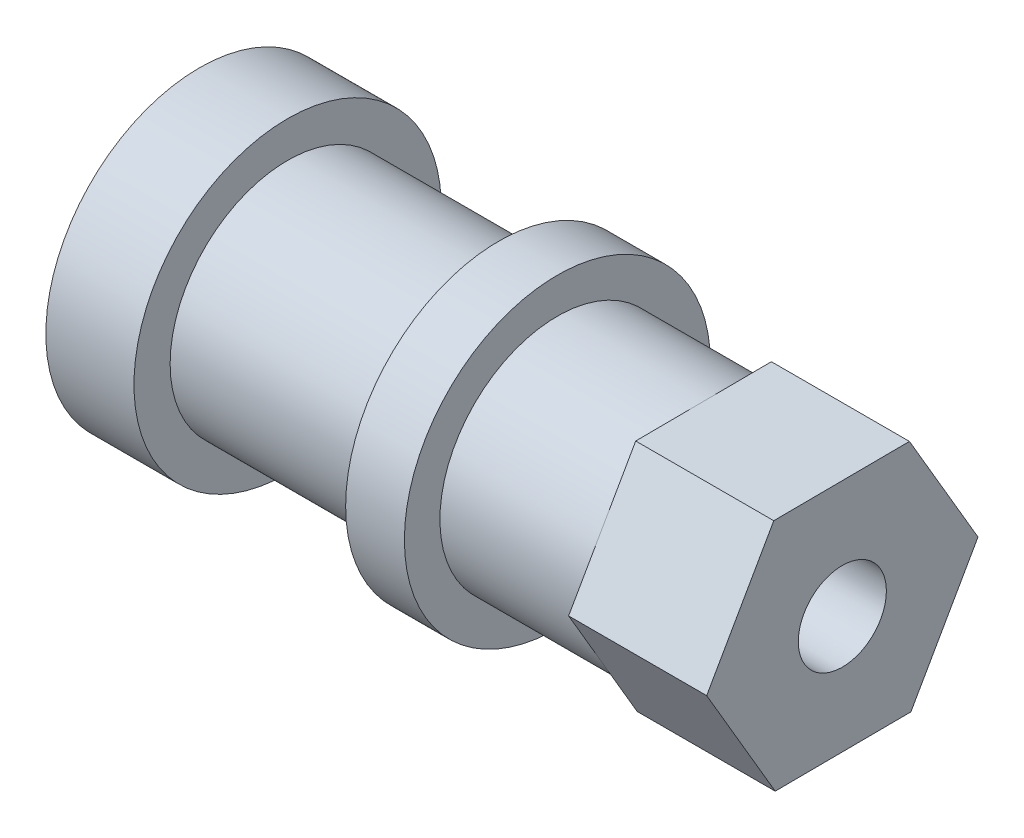
ISO-10303-21;
HEADER;
FILE_DESCRIPTION(('STEP AP214'),'2;1');
FILE_NAME('part.step','',(''),(''),'','','');
FILE_SCHEMA(('AUTOMOTIVE_DESIGN { 1 0 10303 214 1 1 1 1 }'));
ENDSEC;
DATA;
#1=APPLICATION_CONTEXT('core data for automotive mechanical design processes');
#2=APPLICATION_PROTOCOL_DEFINITION('international standard','automotive_design',2000,#1);
#3=PRODUCT_CONTEXT('',#1,'mechanical');
#4=PRODUCT('Part','Part','',(#3));
#5=PRODUCT_RELATED_PRODUCT_CATEGORY('part','',(#4));
#6=PRODUCT_DEFINITION_FORMATION('','',#4);
#7=PRODUCT_DEFINITION_CONTEXT('part definition',#1,'design');
#8=PRODUCT_DEFINITION('design','',#6,#7);
#9=PRODUCT_DEFINITION_SHAPE('','',#8);
#10=(LENGTH_UNIT() NAMED_UNIT(*) SI_UNIT(.MILLI.,.METRE.));
#11=(NAMED_UNIT(*) PLANE_ANGLE_UNIT() SI_UNIT($,.RADIAN.));
#12=(NAMED_UNIT(*) SI_UNIT($,.STERADIAN.) SOLID_ANGLE_UNIT());
#13=UNCERTAINTY_MEASURE_WITH_UNIT(LENGTH_MEASURE(1.E-05),#10,'distance_accuracy_value','');
#14=(GEOMETRIC_REPRESENTATION_CONTEXT(3) GLOBAL_UNCERTAINTY_ASSIGNED_CONTEXT((#13)) GLOBAL_UNIT_ASSIGNED_CONTEXT((#10,
#11,#12)) REPRESENTATION_CONTEXT('',''));
#15=CARTESIAN_POINT('',(0.,0.,0.));
#16=DIRECTION('',(0.,0.,1.));
#17=DIRECTION('',(1.,0.,0.));
#18=AXIS2_PLACEMENT_3D('',#15,#16,#17);
#19=CARTESIAN_POINT('',(-28.4987084989847,0.,0.));
#20=DIRECTION('',(1.,0.,0.));
#21=DIRECTION('',(0.,0.,-1.));
#22=AXIS2_PLACEMENT_3D('',#19,#20,#21);
#23=CYLINDRICAL_SURFACE('',#22,4.);
#24=CARTESIAN_POINT('',(0.,0.,0.));
#25=DIRECTION('',(-1.,0.,0.));
#26=DIRECTION('',(0.,0.,1.));
#27=AXIS2_PLACEMENT_3D('',#24,#25,#26);
#28=CIRCLE('',#27,4.);
#29=CARTESIAN_POINT('',(0.,1.97830942188002,3.47653445708521));
#30=VERTEX_POINT('',#29);
#31=CARTESIAN_POINT('',(0.,3.99992186790774,0.0250010126484));
#32=VERTEX_POINT('',#31);
#33=EDGE_CURVE('E214',#30,#32,#28,.T.);
#34=ORIENTED_EDGE('',*,*,#33,.T.);
#35=CARTESIAN_POINT('',(0.,2.02161244602772,-3.45153344443681));
#36=VERTEX_POINT('',#35);
#37=EDGE_CURVE('E219',#32,#36,#28,.T.);
#38=ORIENTED_EDGE('',*,*,#37,.T.);
#39=CARTESIAN_POINT('',(0.,-1.97830942188002,-3.47653445708521));
#40=VERTEX_POINT('',#39);
#41=EDGE_CURVE('E384',#36,#40,#28,.T.);
#42=ORIENTED_EDGE('',*,*,#41,.T.);
#43=CARTESIAN_POINT('',(0.,-3.99992186790774,-0.0250010126484015));
#44=VERTEX_POINT('',#43);
#45=EDGE_CURVE('E381',#40,#44,#28,.T.);
#46=ORIENTED_EDGE('',*,*,#45,.T.);
#47=CARTESIAN_POINT('',(0.,-2.02161244602772,3.45153344443681));
#48=VERTEX_POINT('',#47);
#49=EDGE_CURVE('E62',#44,#48,#28,.T.);
#50=ORIENTED_EDGE('',*,*,#49,.T.);
#51=EDGE_CURVE('E223',#48,#30,#28,.T.);
#52=ORIENTED_EDGE('',*,*,#51,.T.);
#53=EDGE_LOOP('',(#34,#38,#42,#46,#50,#52));
#54=FACE_BOUND('',#53,.T.);
#55=CARTESIAN_POINT('',(-4.99999999999995,0.,0.));
#56=DIRECTION('',(-1.,0.,0.));
#57=DIRECTION('',(0.,-1.,0.));
#58=AXIS2_PLACEMENT_3D('',#55,#56,#57);
#59=CIRCLE('',#58,4.);
#60=CARTESIAN_POINT('',(-4.99999999999995,-4.,0.));
#61=VERTEX_POINT('',#60);
#62=EDGE_CURVE('E11',#61,#61,#59,.T.);
#63=ORIENTED_EDGE('',*,*,#62,.F.);
#64=EDGE_LOOP('',(#63));
#65=FACE_BOUND('',#64,.T.);
#66=ADVANCED_FACE('F39',(#54,#65),#23,.T.);
#67=CARTESIAN_POINT('',(-28.4987084989847,0.,0.));
#68=DIRECTION('',(1.,0.,0.));
#69=DIRECTION('',(0.,0.,-1.));
#70=AXIS2_PLACEMENT_3D('',#67,#68,#69);
#71=CYLINDRICAL_SURFACE('',#70,1.5);
#72=CARTESIAN_POINT('',(-15.1849999999999,0.,0.));
#73=DIRECTION('',(-1.,0.,0.));
#74=DIRECTION('',(0.,0.,1.));
#75=AXIS2_PLACEMENT_3D('',#72,#73,#74);
#76=CIRCLE('',#75,1.5);
#77=CARTESIAN_POINT('',(-15.1849999999999,0.,-1.5));
#78=VERTEX_POINT('',#77);
#79=EDGE_CURVE('E199',#78,#78,#76,.T.);
#80=CARTESIAN_POINT('',(4.7,0.,0.));
#81=DIRECTION('',(1.,0.,0.));
#82=DIRECTION('',(0.,0.,-1.));
#83=AXIS2_PLACEMENT_3D('',#80,#81,#82);
#84=CIRCLE('',#83,1.5);
#85=CARTESIAN_POINT('',(4.69999999999999,0.,-1.5));
#86=VERTEX_POINT('',#85);
#87=EDGE_CURVE('E207',#86,#86,#84,.T.);
#88=CARTESIAN_POINT('',(-15.1849999999999,0.,-1.5));
#89=CARTESIAN_POINT('',(-14.9778645833332,0.,-1.5));
#90=CARTESIAN_POINT('',(-14.7707291666666,0.,-1.5));
#91=CARTESIAN_POINT('',(-14.3564583333332,0.,-1.5));
#92=CARTESIAN_POINT('',(-14.1493229166666,0.,-1.5));
#93=CARTESIAN_POINT('',(-13.7350520833332,0.,-1.5));
#94=CARTESIAN_POINT('',(-13.5279166666666,0.,-1.5));
#95=CARTESIAN_POINT('',(-13.1136458333332,0.,-1.5));
#96=CARTESIAN_POINT('',(-12.9065104166666,0.,-1.5));
#97=CARTESIAN_POINT('',(-12.4922395833332,0.,-1.5));
#98=CARTESIAN_POINT('',(-12.2851041666666,0.,-1.5));
#99=CARTESIAN_POINT('',(-11.8708333333333,0.,-1.5));
#100=CARTESIAN_POINT('',(-11.6636979166666,0.,-1.5));
#101=CARTESIAN_POINT('',(-11.2494270833333,0.,-1.5));
#102=CARTESIAN_POINT('',(-11.0422916666666,0.,-1.5));
#103=CARTESIAN_POINT('',(-10.6280208333333,0.,-1.5));
#104=CARTESIAN_POINT('',(-10.4208854166666,0.,-1.5));
#105=CARTESIAN_POINT('',(-10.0066145833333,0.,-1.5));
#106=CARTESIAN_POINT('',(-9.7994791666666,0.,-1.5));
#107=CARTESIAN_POINT('',(-9.38520833333327,0.,-1.5));
#108=CARTESIAN_POINT('',(-9.1780729166666,0.,-1.5));
#109=CARTESIAN_POINT('',(-8.76380208333327,0.,-1.5));
#110=CARTESIAN_POINT('',(-8.5566666666666,0.,-1.5));
#111=CARTESIAN_POINT('',(-8.14239583333327,0.,-1.5));
#112=CARTESIAN_POINT('',(-7.93526041666661,0.,-1.5));
#113=CARTESIAN_POINT('',(-7.52098958333327,0.,-1.5));
#114=CARTESIAN_POINT('',(-7.31385416666661,0.,-1.5));
#115=CARTESIAN_POINT('',(-6.89958333333328,0.,-1.5));
#116=CARTESIAN_POINT('',(-6.69244791666661,0.,-1.5));
#117=CARTESIAN_POINT('',(-6.27817708333328,0.,-1.5));
#118=CARTESIAN_POINT('',(-6.07104166666661,0.,-1.5));
#119=CARTESIAN_POINT('',(-5.65677083333328,0.,-1.5));
#120=CARTESIAN_POINT('',(-5.44963541666662,0.,-1.5));
#121=CARTESIAN_POINT('',(-5.03536458333329,0.,-1.5));
#122=CARTESIAN_POINT('',(-4.82822916666662,0.,-1.5));
#123=CARTESIAN_POINT('',(-4.41395833333329,0.,-1.5));
#124=CARTESIAN_POINT('',(-4.20682291666663,0.,-1.5));
#125=CARTESIAN_POINT('',(-3.79255208333329,0.,-1.5));
#126=CARTESIAN_POINT('',(-3.58541666666663,0.,-1.5));
#127=CARTESIAN_POINT('',(-3.1711458333333,0.,-1.5));
#128=CARTESIAN_POINT('',(-2.96401041666663,0.,-1.5));
#129=CARTESIAN_POINT('',(-2.5497395833333,0.,-1.5));
#130=CARTESIAN_POINT('',(-2.34260416666663,0.,-1.5));
#131=CARTESIAN_POINT('',(-1.9283333333333,0.,-1.5));
#132=CARTESIAN_POINT('',(-1.72119791666664,0.,-1.5));
#133=CARTESIAN_POINT('',(-1.30692708333331,0.,-1.5));
#134=CARTESIAN_POINT('',(-1.09979166666664,0.,-1.5));
#135=CARTESIAN_POINT('',(-0.685520833333309,0.,-1.5));
#136=CARTESIAN_POINT('',(-0.478385416666645,0.,-1.5));
#137=CARTESIAN_POINT('',(-0.0641145833333139,0.,-1.5));
#138=CARTESIAN_POINT('',(0.143020833333352,0.,-1.5));
#139=CARTESIAN_POINT('',(0.557291666666684,0.,-1.5));
#140=CARTESIAN_POINT('',(0.76442708333335,0.,-1.5));
#141=CARTESIAN_POINT('',(1.17869791666668,0.,-1.5));
#142=CARTESIAN_POINT('',(1.38583333333335,0.,-1.5));
#143=CARTESIAN_POINT('',(1.80010416666668,0.,-1.5));
#144=CARTESIAN_POINT('',(2.00723958333334,0.,-1.5));
#145=CARTESIAN_POINT('',(2.42151041666667,0.,-1.5));
#146=CARTESIAN_POINT('',(2.62864583333334,0.,-1.5));
#147=CARTESIAN_POINT('',(3.04291666666666,0.,-1.5));
#148=CARTESIAN_POINT('',(3.25005208333333,0.,-1.5));
#149=CARTESIAN_POINT('',(3.66432291666666,0.,-1.5));
#150=CARTESIAN_POINT('',(3.87145833333333,0.,-1.5));
#151=CARTESIAN_POINT('',(4.28572916666666,0.,-1.5));
#152=CARTESIAN_POINT('',(4.49286458333333,0.,-1.5));
#153=CARTESIAN_POINT('',(4.69999999999999,0.,-1.5));
#154=B_SPLINE_CURVE_WITH_KNOTS('',3,(#88,#89,#90,#91,#92,#93,#94,#95,#96,#97,#98,#99,#100,#101,
#102,#103,#104,#105,#106,#107,#108,#109,#110,#111,#112,#113,#114,#115,#116,#117,#118,#119,#120,
#121,#122,#123,#124,#125,#126,#127,#128,#129,#130,#131,#132,#133,#134,#135,#136,#137,#138,#139,
#140,#141,#142,#143,#144,#145,#146,#147,#148,#149,#150,#151,#152,#153),.UNSPECIFIED.,.F.,.F.,(4,
2,2,2,2,2,2,2,2,2,2,2,2,2,2,2,2,2,2,2,2,2,2,2,2,2,2,2,2,2,2,2,4),(0.,0.621406249999996,
1.24281249999999,1.86421874999999,2.48562499999999,3.10703124999998,3.72843749999998,
4.34984374999998,4.97124999999997,5.59265624999997,6.21406249999997,6.83546874999996,
7.45687499999996,8.07828124999996,8.69968749999995,9.32109374999995,9.94249999999995,
10.5639062499999,11.1853124999999,11.8067187499999,12.4281249999999,13.0495312499999,
13.6709374999999,14.2923437499999,14.9137499999999,15.5351562499999,16.1565624999999,
16.7779687499999,17.3993749999999,18.0207812499999,18.6421874999999,19.2635937499999,
19.8849999999999),.UNSPECIFIED.);
#155=EDGE_CURVE('BSEAM305',#78,#86,#154,.T.);
#156=ORIENTED_EDGE('',*,*,#79,.T.);
#157=ORIENTED_EDGE('',*,*,#87,.T.);
#158=ORIENTED_EDGE('',*,*,#155,.T.);
#159=ORIENTED_EDGE('',*,*,#155,.F.);
#160=EDGE_LOOP('',(#156,#158,#157,#159));
#161=FACE_BOUND('',#160,.T.);
#162=ADVANCED_FACE('F305',(#161),#71,.F.);
#163=CARTESIAN_POINT('',(-6.99999999999996,0.,0.));
#164=DIRECTION('',(-1.,0.,0.));
#165=DIRECTION('',(0.,-1.,0.));
#166=AXIS2_PLACEMENT_3D('',#163,#164,#165);
#167=CIRCLE('',#166,4.);
#168=CARTESIAN_POINT('',(-6.99999999999996,0.,-4.));
#169=VERTEX_POINT('',#168);
#170=EDGE_CURVE('E187',#169,#169,#167,.T.);
#171=CARTESIAN_POINT('',(-14.1849999999999,0.,0.));
#172=DIRECTION('',(-1.,0.,0.));
#173=DIRECTION('',(0.,-1.,0.));
#174=AXIS2_PLACEMENT_3D('',#171,#172,#173);
#175=CIRCLE('',#174,4.);
#176=CARTESIAN_POINT('',(-14.1849999999999,0.,-4.));
#177=VERTEX_POINT('',#176);
#178=EDGE_CURVE('E47',#177,#177,#175,.T.);
#179=CARTESIAN_POINT('',(-6.99999999999996,0.,-4.));
#180=CARTESIAN_POINT('',(-7.07484374999996,0.,-4.));
#181=CARTESIAN_POINT('',(-7.14968749999996,0.,-4.));
#182=CARTESIAN_POINT('',(-7.29937499999996,0.,-4.));
#183=CARTESIAN_POINT('',(-7.37421874999996,0.,-4.));
#184=CARTESIAN_POINT('',(-7.52390624999995,0.,-4.));
#185=CARTESIAN_POINT('',(-7.59874999999995,0.,-4.));
#186=CARTESIAN_POINT('',(-7.74843749999995,0.,-4.));
#187=CARTESIAN_POINT('',(-7.82328124999995,0.,-4.));
#188=CARTESIAN_POINT('',(-7.97296874999995,0.,-4.));
#189=CARTESIAN_POINT('',(-8.04781249999995,0.,-4.));
#190=CARTESIAN_POINT('',(-8.19749999999995,0.,-4.));
#191=CARTESIAN_POINT('',(-8.27234374999995,0.,-4.));
#192=CARTESIAN_POINT('',(-8.42203124999995,0.,-4.));
#193=CARTESIAN_POINT('',(-8.49687499999995,0.,-4.));
#194=CARTESIAN_POINT('',(-8.64656249999995,0.,-4.));
#195=CARTESIAN_POINT('',(-8.72140624999994,0.,-4.));
#196=CARTESIAN_POINT('',(-8.87109374999994,0.,-4.));
#197=CARTESIAN_POINT('',(-8.94593749999994,0.,-4.));
#198=CARTESIAN_POINT('',(-9.09562499999994,0.,-4.));
#199=CARTESIAN_POINT('',(-9.17046874999994,0.,-4.));
#200=CARTESIAN_POINT('',(-9.32015624999994,0.,-4.));
#201=CARTESIAN_POINT('',(-9.39499999999994,0.,-4.));
#202=CARTESIAN_POINT('',(-9.54468749999994,0.,-4.));
#203=CARTESIAN_POINT('',(-9.61953124999994,0.,-4.));
#204=CARTESIAN_POINT('',(-9.76921874999993,0.,-4.));
#205=CARTESIAN_POINT('',(-9.84406249999994,0.,-4.));
#206=CARTESIAN_POINT('',(-9.99374999999993,0.,-4.));
#207=CARTESIAN_POINT('',(-10.0685937499999,0.,-4.));
#208=CARTESIAN_POINT('',(-10.2182812499999,0.,-4.));
#209=CARTESIAN_POINT('',(-10.2931249999999,0.,-4.));
#210=CARTESIAN_POINT('',(-10.4428124999999,0.,-4.));
#211=CARTESIAN_POINT('',(-10.5176562499999,0.,-4.));
#212=CARTESIAN_POINT('',(-10.6673437499999,0.,-4.));
#213=CARTESIAN_POINT('',(-10.7421874999999,0.,-4.));
#214=CARTESIAN_POINT('',(-10.8918749999999,0.,-4.));
#215=CARTESIAN_POINT('',(-10.9667187499999,0.,-4.));
#216=CARTESIAN_POINT('',(-11.1164062499999,0.,-4.));
#217=CARTESIAN_POINT('',(-11.1912499999999,0.,-4.));
#218=CARTESIAN_POINT('',(-11.3409374999999,0.,-4.));
#219=CARTESIAN_POINT('',(-11.4157812499999,0.,-4.));
#220=CARTESIAN_POINT('',(-11.5654687499999,0.,-4.));
#221=CARTESIAN_POINT('',(-11.6403124999999,0.,-4.));
#222=CARTESIAN_POINT('',(-11.7899999999999,0.,-4.));
#223=CARTESIAN_POINT('',(-11.8648437499999,0.,-4.));
#224=CARTESIAN_POINT('',(-12.0145312499999,0.,-4.));
#225=CARTESIAN_POINT('',(-12.0893749999999,0.,-4.));
#226=CARTESIAN_POINT('',(-12.2390624999999,0.,-4.));
#227=CARTESIAN_POINT('',(-12.3139062499999,0.,-4.));
#228=CARTESIAN_POINT('',(-12.4635937499999,0.,-4.));
#229=CARTESIAN_POINT('',(-12.5384374999999,0.,-4.));
#230=CARTESIAN_POINT('',(-12.6881249999999,0.,-4.));
#231=CARTESIAN_POINT('',(-12.7629687499999,0.,-4.));
#232=CARTESIAN_POINT('',(-12.9126562499999,0.,-4.));
#233=CARTESIAN_POINT('',(-12.9874999999999,0.,-4.));
#234=CARTESIAN_POINT('',(-13.1371874999999,0.,-4.));
#235=CARTESIAN_POINT('',(-13.2120312499999,0.,-4.));
#236=CARTESIAN_POINT('',(-13.3617187499999,0.,-4.));
#237=CARTESIAN_POINT('',(-13.4365624999999,0.,-4.));
#238=CARTESIAN_POINT('',(-13.5862499999999,0.,-4.));
#239=CARTESIAN_POINT('',(-13.6610937499999,0.,-4.));
#240=CARTESIAN_POINT('',(-13.8107812499999,0.,-4.));
#241=CARTESIAN_POINT('',(-13.8856249999999,0.,-4.));
#242=CARTESIAN_POINT('',(-14.0353124999999,0.,-4.));
#243=CARTESIAN_POINT('',(-14.1101562499999,0.,-4.));
#244=CARTESIAN_POINT('',(-14.1849999999999,0.,-4.));
#245=B_SPLINE_CURVE_WITH_KNOTS('',3,(#179,#180,#181,#182,#183,#184,#185,#186,#187,#188,#189,
#190,#191,#192,#193,#194,#195,#196,#197,#198,#199,#200,#201,#202,#203,#204,#205,#206,#207,#208,
#209,#210,#211,#212,#213,#214,#215,#216,#217,#218,#219,#220,#221,#222,#223,#224,#225,#226,#227,
#228,#229,#230,#231,#232,#233,#234,#235,#236,#237,#238,#239,#240,#241,#242,#243,#244),
.UNSPECIFIED.,.F.,.F.,(4,2,2,2,2,2,2,2,2,2,2,2,2,2,2,2,2,2,2,2,2,2,2,2,2,2,2,2,2,2,2,2,4),(0.,
0.22453125,0.449062499999996,0.673593749999996,0.898124999999993,1.12265624999999,
1.34718749999999,1.57171874999999,1.79624999999999,2.02078124999999,2.24531249999998,
2.46984374999998,2.69437499999998,2.91890624999998,3.14343749999998,3.36796874999997,
3.59249999999997,3.81703124999997,4.04156249999997,4.26609374999997,4.49062499999996,
4.71515624999996,4.93968749999996,5.16421874999996,5.38874999999996,5.61328124999996,
5.83781249999996,6.06234374999995,6.28687499999995,6.51140624999995,6.73593749999995,
6.96046874999995,7.18499999999994),.UNSPECIFIED.);
#246=EDGE_CURVE('BSEAM308',#169,#177,#245,.T.);
#247=ORIENTED_EDGE('',*,*,#170,.T.);
#248=ORIENTED_EDGE('',*,*,#178,.F.);
#249=ORIENTED_EDGE('',*,*,#246,.T.);
#250=ORIENTED_EDGE('',*,*,#246,.F.);
#251=EDGE_LOOP('',(#247,#249,#248,#250));
#252=FACE_BOUND('',#251,.T.);
#253=ADVANCED_FACE('F308',(#252),#23,.T.);
#254=CARTESIAN_POINT('',(0.,0.,0.));
#255=DIRECTION('',(1.,0.,0.));
#256=DIRECTION('',(0.,0.,-1.));
#257=AXIS2_PLACEMENT_3D('',#254,#255,#256);
#258=PLANE('',#257);
#259=ORIENTED_EDGE('',*,*,#33,.F.);
#260=DIRECTION('',(0.,-0.869133614271302,0.494577355470005));
#261=VECTOR('',#260,1.);
#262=CARTESIAN_POINT('',(0.,1.97830942188002,3.47653445708521));
#263=LINE('',#262,#261);
#264=CARTESIAN_POINT('',(0.,3.98548752652518,2.33435697982241));
#265=VERTEX_POINT('',#264);
#266=EDGE_CURVE('E228',#265,#30,#263,.T.);
#267=ORIENTED_EDGE('',*,*,#266,.F.);
#268=DIRECTION('',(0.,-0.0062502531621,0.999980466976935));
#269=VECTOR('',#268,1.);
#270=CARTESIAN_POINT('',(0.,3.99992186790774,0.0250010126484));
#271=LINE('',#270,#269);
#272=EDGE_CURVE('E254',#32,#265,#271,.T.);
#273=ORIENTED_EDGE('',*,*,#272,.F.);
#274=EDGE_LOOP('',(#259,#267,#273));
#275=FACE_BOUND('',#274,.T.);
#276=ADVANCED_FACE('F316',(#275),#258,.F.);
#277=ORIENTED_EDGE('',*,*,#37,.F.);
#278=CARTESIAN_POINT('',(0.,4.01435620929031,-2.28435495452561));
#279=VERTEX_POINT('',#278);
#280=EDGE_CURVE('E255',#279,#32,#271,.T.);
#281=ORIENTED_EDGE('',*,*,#280,.F.);
#282=DIRECTION('',(0.,0.862883361109202,0.50540311150693));
#283=VECTOR('',#282,1.);
#284=CARTESIAN_POINT('',(0.,2.02161244602772,-3.45153344443681));
#285=LINE('',#284,#283);
#286=EDGE_CURVE('E250',#36,#279,#285,.T.);
#287=ORIENTED_EDGE('',*,*,#286,.F.);
#288=EDGE_LOOP('',(#277,#281,#287));
#289=FACE_BOUND('',#288,.T.);
#290=ADVANCED_FACE('F320',(#289),#258,.F.);
#291=ORIENTED_EDGE('',*,*,#41,.F.);
#292=CARTESIAN_POINT('',(0.,0.0288686827651357,-4.61871193434801));
#293=VERTEX_POINT('',#292);
#294=EDGE_CURVE('E251',#293,#36,#285,.T.);
#295=ORIENTED_EDGE('',*,*,#294,.F.);
#296=DIRECTION('',(0.,0.869133614271302,-0.494577355470005));
#297=VECTOR('',#296,1.);
#298=CARTESIAN_POINT('',(0.,-1.97830942188002,-3.47653445708521));
#299=LINE('',#298,#297);
#300=EDGE_CURVE('E246',#40,#293,#299,.T.);
#301=ORIENTED_EDGE('',*,*,#300,.F.);
#302=EDGE_LOOP('',(#291,#295,#301));
#303=FACE_BOUND('',#302,.T.);
#304=ADVANCED_FACE('F406',(#303),#258,.F.);
#305=ORIENTED_EDGE('',*,*,#45,.F.);
#306=CARTESIAN_POINT('',(0.,-3.98548752652517,-2.33435697982241));
#307=VERTEX_POINT('',#306);
#308=EDGE_CURVE('E247',#307,#40,#299,.T.);
#309=ORIENTED_EDGE('',*,*,#308,.F.);
#310=DIRECTION('',(0.,0.00625025316210037,-0.999980466976935));
#311=VECTOR('',#310,1.);
#312=CARTESIAN_POINT('',(0.,-3.99992186790774,-0.0250010126484015));
#313=LINE('',#312,#311);
#314=EDGE_CURVE('E242',#44,#307,#313,.T.);
#315=ORIENTED_EDGE('',*,*,#314,.F.);
#316=EDGE_LOOP('',(#305,#309,#315));
#317=FACE_BOUND('',#316,.T.);
#318=ADVANCED_FACE('F408',(#317),#258,.F.);
#319=ORIENTED_EDGE('',*,*,#49,.F.);
#320=CARTESIAN_POINT('',(0.,-4.01435620929031,2.28435495452561));
#321=VERTEX_POINT('',#320);
#322=EDGE_CURVE('E243',#321,#44,#313,.T.);
#323=ORIENTED_EDGE('',*,*,#322,.F.);
#324=DIRECTION('',(0.,-0.862883361109202,-0.50540311150693));
#325=VECTOR('',#324,1.);
#326=CARTESIAN_POINT('',(0.,-2.02161244602772,3.45153344443681));
#327=LINE('',#326,#325);
#328=EDGE_CURVE('E222',#48,#321,#327,.T.);
#329=ORIENTED_EDGE('',*,*,#328,.F.);
#330=EDGE_LOOP('',(#319,#323,#329));
#331=FACE_BOUND('',#330,.T.);
#332=ADVANCED_FACE('F355',(#331),#258,.F.);
#333=CARTESIAN_POINT('',(4.7,-2.02161244602772,3.45153344443681));
#334=DIRECTION('',(0.,0.50540311150693,-0.862883361109202));
#335=DIRECTION('',(0.,0.862883361109202,0.50540311150693));
#336=AXIS2_PLACEMENT_3D('',#333,#334,#335);
#337=PLANE('',#336);
#338=CARTESIAN_POINT('',(0.,-0.0288686827651344,4.61871193434801));
#339=VERTEX_POINT('',#338);
#340=EDGE_CURVE('E239',#339,#48,#327,.T.);
#341=ORIENTED_EDGE('',*,*,#340,.T.);
#342=ORIENTED_EDGE('',*,*,#328,.T.);
#343=DIRECTION('',(-1.,0.,0.));
#344=VECTOR('',#343,1.);
#345=CARTESIAN_POINT('',(4.7,-4.01435620929031,2.28435495452561));
#346=LINE('',#345,#344);
#347=CARTESIAN_POINT('',(4.7,-4.01435620929031,2.28435495452561));
#348=VERTEX_POINT('',#347);
#349=EDGE_CURVE('E274',#348,#321,#346,.T.);
#350=ORIENTED_EDGE('',*,*,#349,.F.);
#351=DIRECTION('',(0.,-0.862883361109202,-0.50540311150693));
#352=VECTOR('',#351,1.);
#353=CARTESIAN_POINT('',(4.7,-2.02161244602772,3.45153344443681));
#354=LINE('',#353,#352);
#355=CARTESIAN_POINT('',(4.7,-0.0288686827651344,4.61871193434801));
#356=VERTEX_POINT('',#355);
#357=EDGE_CURVE('E224',#356,#348,#354,.T.);
#358=ORIENTED_EDGE('',*,*,#357,.F.);
#359=DIRECTION('',(-1.,0.,0.));
#360=VECTOR('',#359,1.);
#361=CARTESIAN_POINT('',(4.7,-0.0288686827651344,4.61871193434801));
#362=LINE('',#361,#360);
#363=EDGE_CURVE('E238',#356,#339,#362,.T.);
#364=ORIENTED_EDGE('',*,*,#363,.T.);
#365=EDGE_LOOP('',(#341,#342,#350,#358,#364));
#366=FACE_BOUND('',#365,.T.);
#367=ADVANCED_FACE('F41',(#366),#337,.F.);
#368=CARTESIAN_POINT('',(4.7,-3.99992186790774,-0.0250010126484015));
#369=DIRECTION('',(0.,0.999980466976935,0.00625025316210037));
#370=DIRECTION('',(0.,-0.00625025316210037,0.999980466976935));
#371=AXIS2_PLACEMENT_3D('',#368,#369,#370);
#372=PLANE('',#371);
#373=ORIENTED_EDGE('',*,*,#322,.T.);
#374=ORIENTED_EDGE('',*,*,#314,.T.);
#375=DIRECTION('',(-1.,0.,0.));
#376=VECTOR('',#375,1.);
#377=CARTESIAN_POINT('',(4.7,-3.98548752652517,-2.33435697982241));
#378=LINE('',#377,#376);
#379=CARTESIAN_POINT('',(4.7,-3.98548752652517,-2.33435697982241));
#380=VERTEX_POINT('',#379);
#381=EDGE_CURVE('E271',#380,#307,#378,.T.);
#382=ORIENTED_EDGE('',*,*,#381,.F.);
#383=DIRECTION('',(0.,0.00625025316210037,-0.999980466976935));
#384=VECTOR('',#383,1.);
#385=CARTESIAN_POINT('',(4.7,-3.99992186790774,-0.0250010126484015));
#386=LINE('',#385,#384);
#387=EDGE_CURVE('E227',#348,#380,#386,.T.);
#388=ORIENTED_EDGE('',*,*,#387,.F.);
#389=ORIENTED_EDGE('',*,*,#349,.T.);
#390=EDGE_LOOP('',(#373,#374,#382,#388,#389));
#391=FACE_BOUND('',#390,.T.);
#392=ADVANCED_FACE('F369',(#391),#372,.F.);
#393=CARTESIAN_POINT('',(4.7,-1.97830942188002,-3.47653445708521));
#394=DIRECTION('',(0.,0.494577355470005,0.869133614271302));
#395=DIRECTION('',(0.,-0.869133614271302,0.494577355470005));
#396=AXIS2_PLACEMENT_3D('',#393,#394,#395);
#397=PLANE('',#396);
#398=ORIENTED_EDGE('',*,*,#308,.T.);
#399=ORIENTED_EDGE('',*,*,#300,.T.);
#400=DIRECTION('',(-1.,0.,0.));
#401=VECTOR('',#400,1.);
#402=CARTESIAN_POINT('',(4.7,0.0288686827651357,-4.61871193434801));
#403=LINE('',#402,#401);
#404=CARTESIAN_POINT('',(4.7,0.0288686827651357,-4.61871193434801));
#405=VERTEX_POINT('',#404);
#406=EDGE_CURVE('E268',#405,#293,#403,.T.);
#407=ORIENTED_EDGE('',*,*,#406,.F.);
#408=DIRECTION('',(0.,0.869133614271302,-0.494577355470005));
#409=VECTOR('',#408,1.);
#410=CARTESIAN_POINT('',(4.7,-1.97830942188002,-3.47653445708521));
#411=LINE('',#410,#409);
#412=EDGE_CURVE('E230',#380,#405,#411,.T.);
#413=ORIENTED_EDGE('',*,*,#412,.F.);
#414=ORIENTED_EDGE('',*,*,#381,.T.);
#415=EDGE_LOOP('',(#398,#399,#407,#413,#414));
#416=FACE_BOUND('',#415,.T.);
#417=ADVANCED_FACE('F366',(#416),#397,.F.);
#418=CARTESIAN_POINT('',(4.7,2.02161244602772,-3.45153344443681));
#419=DIRECTION('',(0.,-0.50540311150693,0.862883361109202));
#420=DIRECTION('',(0.,-0.862883361109202,-0.50540311150693));
#421=AXIS2_PLACEMENT_3D('',#418,#419,#420);
#422=PLANE('',#421);
#423=ORIENTED_EDGE('',*,*,#294,.T.);
#424=ORIENTED_EDGE('',*,*,#286,.T.);
#425=DIRECTION('',(-1.,0.,0.));
#426=VECTOR('',#425,1.);
#427=CARTESIAN_POINT('',(4.7,4.01435620929031,-2.28435495452561));
#428=LINE('',#427,#426);
#429=CARTESIAN_POINT('',(4.7,4.01435620929031,-2.28435495452561));
#430=VERTEX_POINT('',#429);
#431=EDGE_CURVE('E265',#430,#279,#428,.T.);
#432=ORIENTED_EDGE('',*,*,#431,.F.);
#433=DIRECTION('',(0.,0.862883361109202,0.50540311150693));
#434=VECTOR('',#433,1.);
#435=CARTESIAN_POINT('',(4.7,2.02161244602772,-3.45153344443681));
#436=LINE('',#435,#434);
#437=EDGE_CURVE('E232',#405,#430,#436,.T.);
#438=ORIENTED_EDGE('',*,*,#437,.F.);
#439=ORIENTED_EDGE('',*,*,#406,.T.);
#440=EDGE_LOOP('',(#423,#424,#432,#438,#439));
#441=FACE_BOUND('',#440,.T.);
#442=ADVANCED_FACE('F362',(#441),#422,.F.);
#443=CARTESIAN_POINT('',(4.7,3.99992186790774,0.0250010126484));
#444=DIRECTION('',(0.,-0.999980466976935,-0.0062502531621));
#445=DIRECTION('',(0.,0.0062502531621,-0.999980466976935));
#446=AXIS2_PLACEMENT_3D('',#443,#444,#445);
#447=PLANE('',#446);
#448=ORIENTED_EDGE('',*,*,#280,.T.);
#449=ORIENTED_EDGE('',*,*,#272,.T.);
#450=DIRECTION('',(-1.,0.,0.));
#451=VECTOR('',#450,1.);
#452=CARTESIAN_POINT('',(4.7,3.98548752652518,2.33435697982241));
#453=LINE('',#452,#451);
#454=CARTESIAN_POINT('',(4.7,3.98548752652518,2.33435697982241));
#455=VERTEX_POINT('',#454);
#456=EDGE_CURVE('E262',#455,#265,#453,.T.);
#457=ORIENTED_EDGE('',*,*,#456,.F.);
#458=DIRECTION('',(0.,-0.0062502531621,0.999980466976935));
#459=VECTOR('',#458,1.);
#460=CARTESIAN_POINT('',(4.7,3.99992186790774,0.0250010126484));
#461=LINE('',#460,#459);
#462=EDGE_CURVE('E234',#430,#455,#461,.T.);
#463=ORIENTED_EDGE('',*,*,#462,.F.);
#464=ORIENTED_EDGE('',*,*,#431,.T.);
#465=EDGE_LOOP('',(#448,#449,#457,#463,#464));
#466=FACE_BOUND('',#465,.T.);
#467=ADVANCED_FACE('F358',(#466),#447,.F.);
#468=CARTESIAN_POINT('',(4.7,1.97830942188002,3.47653445708521));
#469=DIRECTION('',(0.,-0.494577355470005,-0.869133614271302));
#470=DIRECTION('',(0.,0.869133614271302,-0.494577355470005));
#471=AXIS2_PLACEMENT_3D('',#468,#469,#470);
#472=PLANE('',#471);
#473=ORIENTED_EDGE('',*,*,#266,.T.);
#474=EDGE_CURVE('E258',#30,#339,#263,.T.);
#475=ORIENTED_EDGE('',*,*,#474,.T.);
#476=ORIENTED_EDGE('',*,*,#363,.F.);
#477=DIRECTION('',(0.,-0.869133614271302,0.494577355470005));
#478=VECTOR('',#477,1.);
#479=CARTESIAN_POINT('',(4.7,1.97830942188002,3.47653445708521));
#480=LINE('',#479,#478);
#481=EDGE_CURVE('E236',#455,#356,#480,.T.);
#482=ORIENTED_EDGE('',*,*,#481,.F.);
#483=ORIENTED_EDGE('',*,*,#456,.T.);
#484=EDGE_LOOP('',(#473,#475,#476,#482,#483));
#485=FACE_BOUND('',#484,.T.);
#486=ADVANCED_FACE('F350',(#485),#472,.F.);
#487=CARTESIAN_POINT('',(4.7,0.,0.));
#488=DIRECTION('',(1.,0.,0.));
#489=DIRECTION('',(0.,0.,-1.));
#490=AXIS2_PLACEMENT_3D('',#487,#488,#489);
#491=PLANE('',#490);
#492=ORIENTED_EDGE('',*,*,#87,.F.);
#493=EDGE_LOOP('',(#492));
#494=FACE_BOUND('',#493,.T.);
#495=ORIENTED_EDGE('',*,*,#357,.T.);
#496=ORIENTED_EDGE('',*,*,#387,.T.);
#497=ORIENTED_EDGE('',*,*,#412,.T.);
#498=ORIENTED_EDGE('',*,*,#437,.T.);
#499=ORIENTED_EDGE('',*,*,#462,.T.);
#500=ORIENTED_EDGE('',*,*,#481,.T.);
#501=EDGE_LOOP('',(#495,#496,#497,#498,#499,#500));
#502=FACE_BOUND('',#501,.T.);
#503=ADVANCED_FACE('F349',(#494,#502),#491,.T.);
#504=ORIENTED_EDGE('',*,*,#51,.F.);
#505=ORIENTED_EDGE('',*,*,#340,.F.);
#506=ORIENTED_EDGE('',*,*,#474,.F.);
#507=EDGE_LOOP('',(#504,#505,#506));
#508=FACE_BOUND('',#507,.T.);
#509=ADVANCED_FACE('F323',(#508),#258,.F.);
#510=CARTESIAN_POINT('',(-14.1849999999999,0.,0.));
#511=DIRECTION('',(-1.,0.,0.));
#512=DIRECTION('',(0.,-1.,0.));
#513=AXIS2_PLACEMENT_3D('',#510,#511,#512);
#514=CYLINDRICAL_SURFACE('',#513,5.23101223305247);
#515=CARTESIAN_POINT('',(-14.1849999999999,0.,0.));
#516=DIRECTION('',(-1.,0.,0.));
#517=DIRECTION('',(0.,-1.,0.));
#518=AXIS2_PLACEMENT_3D('',#515,#516,#517);
#519=CIRCLE('',#518,5.23101223305247);
#520=CARTESIAN_POINT('',(-14.1849999999999,-5.23101223305246,0.));
#521=VERTEX_POINT('',#520);
#522=EDGE_CURVE('E211',#521,#521,#519,.T.);
#523=ORIENTED_EDGE('',*,*,#522,.T.);
#524=EDGE_LOOP('',(#523));
#525=FACE_BOUND('',#524,.T.);
#526=CARTESIAN_POINT('',(-17.1849999999999,0.,0.));
#527=DIRECTION('',(-1.,0.,0.));
#528=DIRECTION('',(0.,-1.,0.));
#529=AXIS2_PLACEMENT_3D('',#526,#527,#528);
#530=CIRCLE('',#529,5.23101223305247);
#531=CARTESIAN_POINT('',(-17.1849999999999,-5.23101223305246,0.));
#532=VERTEX_POINT('',#531);
#533=EDGE_CURVE('E210',#532,#532,#530,.T.);
#534=ORIENTED_EDGE('',*,*,#533,.F.);
#535=EDGE_LOOP('',(#534));
#536=FACE_BOUND('',#535,.T.);
#537=ADVANCED_FACE('F331',(#525,#536),#514,.T.);
#538=CARTESIAN_POINT('',(-14.1849999999999,0.,0.));
#539=DIRECTION('',(-1.,0.,0.));
#540=DIRECTION('',(0.,-1.,0.));
#541=AXIS2_PLACEMENT_3D('',#538,#539,#540);
#542=PLANE('',#541);
#543=ORIENTED_EDGE('',*,*,#178,.T.);
#544=EDGE_LOOP('',(#543));
#545=FACE_BOUND('',#544,.T.);
#546=ORIENTED_EDGE('',*,*,#522,.F.);
#547=EDGE_LOOP('',(#546));
#548=FACE_BOUND('',#547,.T.);
#549=ADVANCED_FACE('F327',(#545,#548),#542,.F.);
#550=CARTESIAN_POINT('',(-17.1849999999999,-11.8967218413146,10.2331817842931));
#551=DIRECTION('',(1.,0.,0.));
#552=DIRECTION('',(0.,-0.892432352975178,-0.451181222307829));
#553=AXIS2_PLACEMENT_3D('',#550,#551,#552);
#554=PLANE('',#553);
#555=DIRECTION('',(0.,0.500000000000001,0.866025403784438));
#556=VECTOR('',#555,1.);
#557=CARTESIAN_POINT('',(-17.1849999999999,-2.88675134594813,0.));
#558=LINE('',#557,#556);
#559=CARTESIAN_POINT('',(-17.1849999999999,-2.88675134594813,0.));
#560=VERTEX_POINT('',#559);
#561=CARTESIAN_POINT('',(-17.1849999999999,-1.44337567297406,2.5));
#562=VERTEX_POINT('',#561);
#563=EDGE_CURVE('E186',#560,#562,#558,.T.);
#564=ORIENTED_EDGE('',*,*,#563,.F.);
#565=DIRECTION('',(0.,-0.5,0.866025403784438));
#566=VECTOR('',#565,1.);
#567=CARTESIAN_POINT('',(-17.1849999999999,-1.44337567297406,-2.5));
#568=LINE('',#567,#566);
#569=CARTESIAN_POINT('',(-17.1849999999999,-1.44337567297406,-2.5));
#570=VERTEX_POINT('',#569);
#571=EDGE_CURVE('E54',#570,#560,#568,.T.);
#572=ORIENTED_EDGE('',*,*,#571,.F.);
#573=DIRECTION('',(0.,-1.,0.));
#574=VECTOR('',#573,1.);
#575=CARTESIAN_POINT('',(-17.1849999999999,1.44337567297407,-2.5));
#576=LINE('',#575,#574);
#577=CARTESIAN_POINT('',(-17.1849999999999,1.44337567297407,-2.5));
#578=VERTEX_POINT('',#577);
#579=EDGE_CURVE('E169',#578,#570,#576,.T.);
#580=ORIENTED_EDGE('',*,*,#579,.F.);
#581=DIRECTION('',(0.,-0.5,-0.866025403784438));
#582=VECTOR('',#581,1.);
#583=CARTESIAN_POINT('',(-17.1849999999999,2.88675134594813,0.));
#584=LINE('',#583,#582);
#585=CARTESIAN_POINT('',(-17.1849999999999,2.88675134594813,0.));
#586=VERTEX_POINT('',#585);
#587=EDGE_CURVE('E172',#586,#578,#584,.T.);
#588=ORIENTED_EDGE('',*,*,#587,.F.);
#589=DIRECTION('',(0.,0.5,-0.866025403784439));
#590=VECTOR('',#589,1.);
#591=CARTESIAN_POINT('',(-17.1849999999999,1.44337567297407,2.5));
#592=LINE('',#591,#590);
#593=CARTESIAN_POINT('',(-17.1849999999999,1.44337567297407,2.5));
#594=VERTEX_POINT('',#593);
#595=EDGE_CURVE('E192',#594,#586,#592,.T.);
#596=ORIENTED_EDGE('',*,*,#595,.F.);
#597=DIRECTION('',(0.,1.,0.));
#598=VECTOR('',#597,1.);
#599=CARTESIAN_POINT('',(-17.1849999999999,-1.44337567297406,2.5));
#600=LINE('',#599,#598);
#601=EDGE_CURVE('E189',#562,#594,#600,.T.);
#602=ORIENTED_EDGE('',*,*,#601,.F.);
#603=EDGE_LOOP('',(#564,#572,#580,#588,#596,#602));
#604=FACE_BOUND('',#603,.T.);
#605=ORIENTED_EDGE('',*,*,#533,.T.);
#606=EDGE_LOOP('',(#605));
#607=FACE_BOUND('',#606,.T.);
#608=ADVANCED_FACE('F330',(#604,#607),#554,.F.);
#609=CARTESIAN_POINT('',(-15.1849999999999,-1.44337567297406,-2.5));
#610=DIRECTION('',(0.,-0.866025403784439,-0.5));
#611=DIRECTION('',(0.,0.5,-0.866025403784439));
#612=AXIS2_PLACEMENT_3D('',#609,#610,#611);
#613=PLANE('',#612);
#614=ORIENTED_EDGE('',*,*,#571,.T.);
#615=DIRECTION('',(-1.,0.,0.));
#616=VECTOR('',#615,1.);
#617=CARTESIAN_POINT('',(-15.1849999999999,-2.88675134594813,0.));
#618=LINE('',#617,#616);
#619=CARTESIAN_POINT('',(-15.1849999999999,-2.88675134594813,0.));
#620=VERTEX_POINT('',#619);
#621=EDGE_CURVE('E146',#620,#560,#618,.T.);
#622=ORIENTED_EDGE('',*,*,#621,.F.);
#623=DIRECTION('',(0.,-0.5,0.866025403784438));
#624=VECTOR('',#623,1.);
#625=CARTESIAN_POINT('',(-15.1849999999999,-1.44337567297406,-2.5));
#626=LINE('',#625,#624);
#627=CARTESIAN_POINT('',(-15.1849999999999,-1.44337567297406,-2.5));
#628=VERTEX_POINT('',#627);
#629=EDGE_CURVE('E150',#628,#620,#626,.T.);
#630=ORIENTED_EDGE('',*,*,#629,.F.);
#631=DIRECTION('',(-1.,0.,0.));
#632=VECTOR('',#631,1.);
#633=CARTESIAN_POINT('',(-15.1849999999999,-1.44337567297406,-2.5));
#634=LINE('',#633,#632);
#635=EDGE_CURVE('E197',#628,#570,#634,.T.);
#636=ORIENTED_EDGE('',*,*,#635,.T.);
#637=EDGE_LOOP('',(#614,#622,#630,#636));
#638=FACE_BOUND('',#637,.T.);
#639=ADVANCED_FACE('F148',(#638),#613,.F.);
#640=CARTESIAN_POINT('',(-15.1849999999999,1.44337567297407,-2.5));
#641=DIRECTION('',(0.,0.,-1.));
#642=DIRECTION('',(-1.,0.,0.));
#643=AXIS2_PLACEMENT_3D('',#640,#641,#642);
#644=PLANE('',#643);
#645=ORIENTED_EDGE('',*,*,#579,.T.);
#646=ORIENTED_EDGE('',*,*,#635,.F.);
#647=DIRECTION('',(0.,-1.,0.));
#648=VECTOR('',#647,1.);
#649=CARTESIAN_POINT('',(-15.1849999999999,1.44337567297407,-2.5));
#650=LINE('',#649,#648);
#651=CARTESIAN_POINT('',(-15.1849999999999,1.44337567297407,-2.5));
#652=VERTEX_POINT('',#651);
#653=EDGE_CURVE('E156',#652,#628,#650,.T.);
#654=ORIENTED_EDGE('',*,*,#653,.F.);
#655=DIRECTION('',(-1.,0.,0.));
#656=VECTOR('',#655,1.);
#657=CARTESIAN_POINT('',(-15.1849999999999,1.44337567297407,-2.5));
#658=LINE('',#657,#656);
#659=EDGE_CURVE('E200',#652,#578,#658,.T.);
#660=ORIENTED_EDGE('',*,*,#659,.T.);
#661=EDGE_LOOP('',(#645,#646,#654,#660));
#662=FACE_BOUND('',#661,.T.);
#663=ADVANCED_FACE('F346',(#662),#644,.F.);
#664=CARTESIAN_POINT('',(-15.1849999999999,2.88675134594813,0.));
#665=DIRECTION('',(0.,0.866025403784438,-0.5));
#666=DIRECTION('',(0.,0.5,0.866025403784438));
#667=AXIS2_PLACEMENT_3D('',#664,#665,#666);
#668=PLANE('',#667);
#669=ORIENTED_EDGE('',*,*,#587,.T.);
#670=ORIENTED_EDGE('',*,*,#659,.F.);
#671=DIRECTION('',(0.,-0.5,-0.866025403784438));
#672=VECTOR('',#671,1.);
#673=CARTESIAN_POINT('',(-15.1849999999999,2.88675134594813,0.));
#674=LINE('',#673,#672);
#675=CARTESIAN_POINT('',(-15.1849999999999,2.88675134594813,0.));
#676=VERTEX_POINT('',#675);
#677=EDGE_CURVE('E182',#676,#652,#674,.T.);
#678=ORIENTED_EDGE('',*,*,#677,.F.);
#679=DIRECTION('',(-1.,0.,0.));
#680=VECTOR('',#679,1.);
#681=CARTESIAN_POINT('',(-15.1849999999999,2.88675134594813,0.));
#682=LINE('',#681,#680);
#683=EDGE_CURVE('E202',#676,#586,#682,.T.);
#684=ORIENTED_EDGE('',*,*,#683,.T.);
#685=EDGE_LOOP('',(#669,#670,#678,#684));
#686=FACE_BOUND('',#685,.T.);
#687=ADVANCED_FACE('F466',(#686),#668,.F.);
#688=CARTESIAN_POINT('',(-15.1849999999999,1.44337567297407,2.5));
#689=DIRECTION('',(0.,0.866025403784439,0.5));
#690=DIRECTION('',(0.,-0.5,0.866025403784439));
#691=AXIS2_PLACEMENT_3D('',#688,#689,#690);
#692=PLANE('',#691);
#693=ORIENTED_EDGE('',*,*,#595,.T.);
#694=ORIENTED_EDGE('',*,*,#683,.F.);
#695=DIRECTION('',(0.,0.5,-0.866025403784439));
#696=VECTOR('',#695,1.);
#697=CARTESIAN_POINT('',(-15.1849999999999,1.44337567297407,2.5));
#698=LINE('',#697,#696);
#699=CARTESIAN_POINT('',(-15.1849999999999,1.44337567297407,2.5));
#700=VERTEX_POINT('',#699);
#701=EDGE_CURVE('E179',#700,#676,#698,.T.);
#702=ORIENTED_EDGE('',*,*,#701,.F.);
#703=DIRECTION('',(-1.,0.,0.));
#704=VECTOR('',#703,1.);
#705=CARTESIAN_POINT('',(-15.1849999999999,1.44337567297407,2.5));
#706=LINE('',#705,#704);
#707=EDGE_CURVE('E204',#700,#594,#706,.T.);
#708=ORIENTED_EDGE('',*,*,#707,.T.);
#709=EDGE_LOOP('',(#693,#694,#702,#708));
#710=FACE_BOUND('',#709,.T.);
#711=ADVANCED_FACE('F475',(#710),#692,.F.);
#712=CARTESIAN_POINT('',(-15.1849999999999,-1.44337567297406,2.5));
#713=DIRECTION('',(0.,0.,1.));
#714=DIRECTION('',(1.,0.,0.));
#715=AXIS2_PLACEMENT_3D('',#712,#713,#714);
#716=PLANE('',#715);
#717=ORIENTED_EDGE('',*,*,#601,.T.);
#718=ORIENTED_EDGE('',*,*,#707,.F.);
#719=DIRECTION('',(0.,1.,0.));
#720=VECTOR('',#719,1.);
#721=CARTESIAN_POINT('',(-15.1849999999999,-1.44337567297406,2.5));
#722=LINE('',#721,#720);
#723=CARTESIAN_POINT('',(-15.1849999999999,-1.44337567297406,2.5));
#724=VERTEX_POINT('',#723);
#725=EDGE_CURVE('E164',#724,#700,#722,.T.);
#726=ORIENTED_EDGE('',*,*,#725,.F.);
#727=DIRECTION('',(-1.,0.,0.));
#728=VECTOR('',#727,1.);
#729=CARTESIAN_POINT('',(-15.1849999999999,-1.44337567297406,2.5));
#730=LINE('',#729,#728);
#731=EDGE_CURVE('E155',#724,#562,#730,.T.);
#732=ORIENTED_EDGE('',*,*,#731,.T.);
#733=EDGE_LOOP('',(#717,#718,#726,#732));
#734=FACE_BOUND('',#733,.T.);
#735=ADVANCED_FACE('F484',(#734),#716,.F.);
#736=CARTESIAN_POINT('',(-15.1849999999999,-2.88675134594813,0.));
#737=DIRECTION('',(0.,-0.866025403784438,0.500000000000001));
#738=DIRECTION('',(0.,-0.500000000000001,-0.866025403784438));
#739=AXIS2_PLACEMENT_3D('',#736,#737,#738);
#740=PLANE('',#739);
#741=ORIENTED_EDGE('',*,*,#563,.T.);
#742=ORIENTED_EDGE('',*,*,#731,.F.);
#743=DIRECTION('',(0.,0.500000000000001,0.866025403784438));
#744=VECTOR('',#743,1.);
#745=CARTESIAN_POINT('',(-15.1849999999999,-2.88675134594813,0.));
#746=LINE('',#745,#744);
#747=EDGE_CURVE('E159',#620,#724,#746,.T.);
#748=ORIENTED_EDGE('',*,*,#747,.F.);
#749=ORIENTED_EDGE('',*,*,#621,.T.);
#750=EDGE_LOOP('',(#741,#742,#748,#749));
#751=FACE_BOUND('',#750,.T.);
#752=ADVANCED_FACE('F160',(#751),#740,.F.);
#753=CARTESIAN_POINT('',(-15.1849999999999,0.,0.));
#754=DIRECTION('',(-1.,0.,0.));
#755=DIRECTION('',(0.,0.,1.));
#756=AXIS2_PLACEMENT_3D('',#753,#754,#755);
#757=PLANE('',#756);
#758=ORIENTED_EDGE('',*,*,#79,.F.);
#759=EDGE_LOOP('',(#758));
#760=FACE_BOUND('',#759,.T.);
#761=ORIENTED_EDGE('',*,*,#629,.T.);
#762=ORIENTED_EDGE('',*,*,#747,.T.);
#763=ORIENTED_EDGE('',*,*,#725,.T.);
#764=ORIENTED_EDGE('',*,*,#701,.T.);
#765=ORIENTED_EDGE('',*,*,#677,.T.);
#766=ORIENTED_EDGE('',*,*,#653,.T.);
#767=EDGE_LOOP('',(#761,#762,#763,#764,#765,#766));
#768=FACE_BOUND('',#767,.T.);
#769=ADVANCED_FACE('F166',(#760,#768),#757,.T.);
#770=CARTESIAN_POINT('',(-4.99999999999995,0.,0.));
#771=DIRECTION('',(-1.,0.,0.));
#772=DIRECTION('',(0.,0.,1.));
#773=AXIS2_PLACEMENT_3D('',#770,#771,#772);
#774=CYLINDRICAL_SURFACE('',#773,5.20953026097015);
#775=CARTESIAN_POINT('',(-4.99999999999995,0.,0.));
#776=DIRECTION('',(-1.,0.,0.));
#777=DIRECTION('',(0.,-1.,0.));
#778=AXIS2_PLACEMENT_3D('',#775,#776,#777);
#779=CIRCLE('',#778,5.20953026097015);
#780=CARTESIAN_POINT('',(-4.99999999999995,0.,5.20953026097015));
#781=VERTEX_POINT('',#780);
#782=EDGE_CURVE('E279',#781,#781,#779,.T.);
#783=CARTESIAN_POINT('',(-6.99999999999995,0.,0.));
#784=DIRECTION('',(-1.,0.,0.));
#785=DIRECTION('',(0.,-1.,0.));
#786=AXIS2_PLACEMENT_3D('',#783,#784,#785);
#787=CIRCLE('',#786,5.20953026097015);
#788=CARTESIAN_POINT('',(-6.99999999999995,0.,5.20953026097015));
#789=VERTEX_POINT('',#788);
#790=EDGE_CURVE('E175',#789,#789,#787,.T.);
#791=CARTESIAN_POINT('',(-4.99999999999995,0.,5.20953026097015));
#792=CARTESIAN_POINT('',(-5.02083333333329,0.,5.20953026097015));
#793=CARTESIAN_POINT('',(-5.04166666666662,0.,5.20953026097015));
#794=CARTESIAN_POINT('',(-5.08333333333329,0.,5.20953026097015));
#795=CARTESIAN_POINT('',(-5.10416666666662,0.,5.20953026097015));
#796=CARTESIAN_POINT('',(-5.14583333333329,0.,5.20953026097015));
#797=CARTESIAN_POINT('',(-5.16666666666662,0.,5.20953026097015));
#798=CARTESIAN_POINT('',(-5.20833333333329,0.,5.20953026097015));
#799=CARTESIAN_POINT('',(-5.22916666666662,0.,5.20953026097015));
#800=CARTESIAN_POINT('',(-5.27083333333329,0.,5.20953026097015));
#801=CARTESIAN_POINT('',(-5.29166666666662,0.,5.20953026097015));
#802=CARTESIAN_POINT('',(-5.33333333333329,0.,5.20953026097015));
#803=CARTESIAN_POINT('',(-5.35416666666662,0.,5.20953026097015));
#804=CARTESIAN_POINT('',(-5.39583333333329,0.,5.20953026097015));
#805=CARTESIAN_POINT('',(-5.41666666666662,0.,5.20953026097015));
#806=CARTESIAN_POINT('',(-5.45833333333329,0.,5.20953026097015));
#807=CARTESIAN_POINT('',(-5.47916666666662,0.,5.20953026097015));
#808=CARTESIAN_POINT('',(-5.52083333333329,0.,5.20953026097015));
#809=CARTESIAN_POINT('',(-5.54166666666662,0.,5.20953026097015));
#810=CARTESIAN_POINT('',(-5.58333333333329,0.,5.20953026097015));
#811=CARTESIAN_POINT('',(-5.60416666666662,0.,5.20953026097015));
#812=CARTESIAN_POINT('',(-5.64583333333329,0.,5.20953026097015));
#813=CARTESIAN_POINT('',(-5.66666666666662,0.,5.20953026097015));
#814=CARTESIAN_POINT('',(-5.70833333333329,0.,5.20953026097015));
#815=CARTESIAN_POINT('',(-5.72916666666662,0.,5.20953026097015));
#816=CARTESIAN_POINT('',(-5.77083333333329,0.,5.20953026097015));
#817=CARTESIAN_POINT('',(-5.79166666666662,0.,5.20953026097015));
#818=CARTESIAN_POINT('',(-5.83333333333329,0.,5.20953026097015));
#819=CARTESIAN_POINT('',(-5.85416666666662,0.,5.20953026097015));
#820=CARTESIAN_POINT('',(-5.89583333333329,0.,5.20953026097015));
#821=CARTESIAN_POINT('',(-5.91666666666662,0.,5.20953026097015));
#822=CARTESIAN_POINT('',(-5.95833333333329,0.,5.20953026097015));
#823=CARTESIAN_POINT('',(-5.97916666666662,0.,5.20953026097015));
#824=CARTESIAN_POINT('',(-6.02083333333329,0.,5.20953026097015));
#825=CARTESIAN_POINT('',(-6.04166666666662,0.,5.20953026097015));
#826=CARTESIAN_POINT('',(-6.08333333333329,0.,5.20953026097015));
#827=CARTESIAN_POINT('',(-6.10416666666662,0.,5.20953026097015));
#828=CARTESIAN_POINT('',(-6.14583333333329,0.,5.20953026097015));
#829=CARTESIAN_POINT('',(-6.16666666666662,0.,5.20953026097015));
#830=CARTESIAN_POINT('',(-6.20833333333329,0.,5.20953026097015));
#831=CARTESIAN_POINT('',(-6.22916666666662,0.,5.20953026097015));
#832=CARTESIAN_POINT('',(-6.27083333333329,0.,5.20953026097015));
#833=CARTESIAN_POINT('',(-6.29166666666662,0.,5.20953026097015));
#834=CARTESIAN_POINT('',(-6.33333333333329,0.,5.20953026097015));
#835=CARTESIAN_POINT('',(-6.35416666666662,0.,5.20953026097015));
#836=CARTESIAN_POINT('',(-6.39583333333329,0.,5.20953026097015));
#837=CARTESIAN_POINT('',(-6.41666666666662,0.,5.20953026097015));
#838=CARTESIAN_POINT('',(-6.45833333333329,0.,5.20953026097015));
#839=CARTESIAN_POINT('',(-6.47916666666662,0.,5.20953026097015));
#840=CARTESIAN_POINT('',(-6.52083333333329,0.,5.20953026097015));
#841=CARTESIAN_POINT('',(-6.54166666666662,0.,5.20953026097015));
#842=CARTESIAN_POINT('',(-6.58333333333329,0.,5.20953026097015));
#843=CARTESIAN_POINT('',(-6.60416666666662,0.,5.20953026097015));
#844=CARTESIAN_POINT('',(-6.64583333333329,0.,5.20953026097015));
#845=CARTESIAN_POINT('',(-6.66666666666662,0.,5.20953026097015));
#846=CARTESIAN_POINT('',(-6.70833333333329,0.,5.20953026097015));
#847=CARTESIAN_POINT('',(-6.72916666666662,0.,5.20953026097015));
#848=CARTESIAN_POINT('',(-6.77083333333329,0.,5.20953026097015));
#849=CARTESIAN_POINT('',(-6.79166666666662,0.,5.20953026097015));
#850=CARTESIAN_POINT('',(-6.83333333333329,0.,5.20953026097015));
#851=CARTESIAN_POINT('',(-6.85416666666662,0.,5.20953026097015));
#852=CARTESIAN_POINT('',(-6.89583333333329,0.,5.20953026097015));
#853=CARTESIAN_POINT('',(-6.91666666666662,0.,5.20953026097015));
#854=CARTESIAN_POINT('',(-6.95833333333329,0.,5.20953026097015));
#855=CARTESIAN_POINT('',(-6.97916666666662,0.,5.20953026097015));
#856=CARTESIAN_POINT('',(-6.99999999999995,0.,5.20953026097015));
#857=B_SPLINE_CURVE_WITH_KNOTS('',3,(#791,#792,#793,#794,#795,#796,#797,#798,#799,#800,#801,
#802,#803,#804,#805,#806,#807,#808,#809,#810,#811,#812,#813,#814,#815,#816,#817,#818,#819,#820,
#821,#822,#823,#824,#825,#826,#827,#828,#829,#830,#831,#832,#833,#834,#835,#836,#837,#838,#839,
#840,#841,#842,#843,#844,#845,#846,#847,#848,#849,#850,#851,#852,#853,#854,#855,#856),
.UNSPECIFIED.,.F.,.F.,(4,2,2,2,2,2,2,2,2,2,2,2,2,2,2,2,2,2,2,2,2,2,2,2,2,2,2,2,2,2,2,2,4),(0.,
0.0624999999999992,0.124999999999999,0.187499999999999,0.249999999999999,0.312499999999999,
0.374999999999999,0.4375,0.5,0.5625,0.625,0.6875,0.749999999999999,0.812499999999999,
0.874999999999999,0.937499999999999,0.999999999999999,1.0625,1.125,1.1875,1.25,1.3125,1.375,
1.4375,1.5,1.5625,1.625,1.6875,1.75,1.8125,1.875,1.9375,2.),.UNSPECIFIED.);
#858=EDGE_CURVE('BSEAM290',#781,#789,#857,.T.);
#859=ORIENTED_EDGE('',*,*,#782,.T.);
#860=ORIENTED_EDGE('',*,*,#790,.F.);
#861=ORIENTED_EDGE('',*,*,#858,.T.);
#862=ORIENTED_EDGE('',*,*,#858,.F.);
#863=EDGE_LOOP('',(#859,#861,#860,#862));
#864=FACE_BOUND('',#863,.T.);
#865=ADVANCED_FACE('F290',(#864),#774,.T.);
#866=CARTESIAN_POINT('',(-4.99999999999995,0.,0.));
#867=DIRECTION('',(-1.,0.,0.));
#868=DIRECTION('',(0.,-1.,0.));
#869=AXIS2_PLACEMENT_3D('',#866,#867,#868);
#870=PLANE('',#869);
#871=ORIENTED_EDGE('',*,*,#62,.T.);
#872=EDGE_LOOP('',(#871));
#873=FACE_BOUND('',#872,.T.);
#874=ORIENTED_EDGE('',*,*,#782,.F.);
#875=EDGE_LOOP('',(#874));
#876=FACE_BOUND('',#875,.T.);
#877=ADVANCED_FACE('F292',(#873,#876),#870,.F.);
#878=CARTESIAN_POINT('',(-6.99999999999995,0.,0.));
#879=DIRECTION('',(-1.,0.,0.));
#880=DIRECTION('',(0.,-1.,0.));
#881=AXIS2_PLACEMENT_3D('',#878,#879,#880);
#882=PLANE('',#881);
#883=ORIENTED_EDGE('',*,*,#170,.F.);
#884=EDGE_LOOP('',(#883));
#885=FACE_BOUND('',#884,.T.);
#886=ORIENTED_EDGE('',*,*,#790,.T.);
#887=EDGE_LOOP('',(#886));
#888=FACE_BOUND('',#887,.T.);
#889=ADVANCED_FACE('F288',(#885,#888),#882,.T.);
#890=CLOSED_SHELL('',(#66,#162,#253,#276,#290,#304,#318,#332,#367,#392,#417,#442,#467,#486,#503,
#509,#537,#549,#608,#639,#663,#687,#711,#735,#752,#769,#865,#877,#889));
#891=MANIFOLD_SOLID_BREP('B2',#890);
#892=ADVANCED_BREP_SHAPE_REPRESENTATION('',(#18,#891),#14);
#893=SHAPE_DEFINITION_REPRESENTATION(#9,#892);
ENDSEC;
END-ISO-10303-21;
